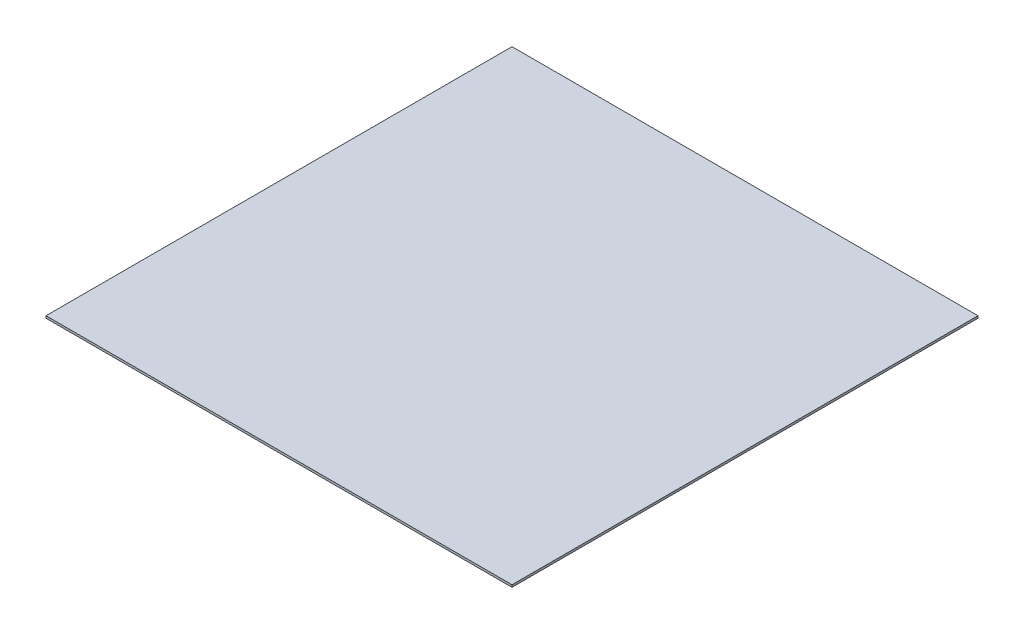
ISO-10303-21;
HEADER;
FILE_DESCRIPTION(('STEP AP214'),'2;1');
FILE_NAME('part.step','',(''),(''),'','','');
FILE_SCHEMA(('AUTOMOTIVE_DESIGN { 1 0 10303 214 1 1 1 1 }'));
ENDSEC;
DATA;
#1=APPLICATION_CONTEXT('core data for automotive mechanical design processes');
#2=APPLICATION_PROTOCOL_DEFINITION('international standard','automotive_design',2000,#1);
#3=PRODUCT_CONTEXT('',#1,'mechanical');
#4=PRODUCT('Part','Part','',(#3));
#5=PRODUCT_RELATED_PRODUCT_CATEGORY('part','',(#4));
#6=PRODUCT_DEFINITION_FORMATION('','',#4);
#7=PRODUCT_DEFINITION_CONTEXT('part definition',#1,'design');
#8=PRODUCT_DEFINITION('design','',#6,#7);
#9=PRODUCT_DEFINITION_SHAPE('','',#8);
#10=(LENGTH_UNIT() NAMED_UNIT(*) SI_UNIT(.MILLI.,.METRE.));
#11=(NAMED_UNIT(*) PLANE_ANGLE_UNIT() SI_UNIT($,.RADIAN.));
#12=(NAMED_UNIT(*) SI_UNIT($,.STERADIAN.) SOLID_ANGLE_UNIT());
#13=UNCERTAINTY_MEASURE_WITH_UNIT(LENGTH_MEASURE(1.E-05),#10,'distance_accuracy_value','');
#14=(GEOMETRIC_REPRESENTATION_CONTEXT(3) GLOBAL_UNCERTAINTY_ASSIGNED_CONTEXT((#13)) GLOBAL_UNIT_ASSIGNED_CONTEXT((#10,
#11,#12)) REPRESENTATION_CONTEXT('',''));
#15=CARTESIAN_POINT('',(0.,0.,0.));
#16=DIRECTION('',(0.,0.,1.));
#17=DIRECTION('',(1.,0.,0.));
#18=AXIS2_PLACEMENT_3D('',#15,#16,#17);
#19=CARTESIAN_POINT('',(0.,9.525,0.));
#20=DIRECTION('',(1.,0.,0.));
#21=DIRECTION('',(0.,0.,-1.));
#22=AXIS2_PLACEMENT_3D('',#19,#20,#21);
#23=PLANE('',#22);
#24=DIRECTION('',(0.,0.,1.));
#25=VECTOR('',#24,1.);
#26=CARTESIAN_POINT('',(0.,0.,0.));
#27=LINE('',#26,#25);
#28=CARTESIAN_POINT('',(0.,0.,0.));
#29=VERTEX_POINT('',#28);
#30=CARTESIAN_POINT('',(0.,0.,2000.));
#31=VERTEX_POINT('',#30);
#32=EDGE_CURVE('E97',#29,#31,#27,.T.);
#33=ORIENTED_EDGE('',*,*,#32,.T.);
#34=DIRECTION('',(0.,-1.,0.));
#35=VECTOR('',#34,1.);
#36=CARTESIAN_POINT('',(0.,9.525,2000.));
#37=LINE('',#36,#35);
#38=CARTESIAN_POINT('',(0.,9.525,2000.));
#39=VERTEX_POINT('',#38);
#40=EDGE_CURVE('E11',#39,#31,#37,.T.);
#41=ORIENTED_EDGE('',*,*,#40,.F.);
#42=DIRECTION('',(0.,0.,1.));
#43=VECTOR('',#42,1.);
#44=CARTESIAN_POINT('',(0.,9.525,0.));
#45=LINE('',#44,#43);
#46=CARTESIAN_POINT('',(0.,9.525,0.));
#47=VERTEX_POINT('',#46);
#48=EDGE_CURVE('E85',#47,#39,#45,.T.);
#49=ORIENTED_EDGE('',*,*,#48,.F.);
#50=DIRECTION('',(0.,-1.,0.));
#51=VECTOR('',#50,1.);
#52=CARTESIAN_POINT('',(0.,9.525,0.));
#53=LINE('',#52,#51);
#54=EDGE_CURVE('E93',#47,#29,#53,.T.);
#55=ORIENTED_EDGE('',*,*,#54,.T.);
#56=EDGE_LOOP('',(#33,#41,#49,#55));
#57=FACE_BOUND('',#56,.T.);
#58=ADVANCED_FACE('F34',(#57),#23,.F.);
#59=CARTESIAN_POINT('',(0.,9.525,2000.));
#60=DIRECTION('',(0.,0.,-1.));
#61=DIRECTION('',(-1.,0.,0.));
#62=AXIS2_PLACEMENT_3D('',#59,#60,#61);
#63=PLANE('',#62);
#64=DIRECTION('',(1.,0.,0.));
#65=VECTOR('',#64,1.);
#66=CARTESIAN_POINT('',(0.,0.,2000.));
#67=LINE('',#66,#65);
#68=CARTESIAN_POINT('',(2000.,0.,2000.));
#69=VERTEX_POINT('',#68);
#70=EDGE_CURVE('E89',#31,#69,#67,.T.);
#71=ORIENTED_EDGE('',*,*,#70,.T.);
#72=DIRECTION('',(0.,-1.,0.));
#73=VECTOR('',#72,1.);
#74=CARTESIAN_POINT('',(2000.,9.525,2000.));
#75=LINE('',#74,#73);
#76=CARTESIAN_POINT('',(2000.,9.525,2000.));
#77=VERTEX_POINT('',#76);
#78=EDGE_CURVE('E42',#77,#69,#75,.T.);
#79=ORIENTED_EDGE('',*,*,#78,.F.);
#80=DIRECTION('',(1.,0.,0.));
#81=VECTOR('',#80,1.);
#82=CARTESIAN_POINT('',(0.,9.525,2000.));
#83=LINE('',#82,#81);
#84=EDGE_CURVE('E80',#39,#77,#83,.T.);
#85=ORIENTED_EDGE('',*,*,#84,.F.);
#86=ORIENTED_EDGE('',*,*,#40,.T.);
#87=EDGE_LOOP('',(#71,#79,#85,#86));
#88=FACE_BOUND('',#87,.T.);
#89=ADVANCED_FACE('F88',(#88),#63,.F.);
#90=CARTESIAN_POINT('',(2000.,9.525,0.));
#91=DIRECTION('',(-1.,0.,0.));
#92=DIRECTION('',(0.,0.,1.));
#93=AXIS2_PLACEMENT_3D('',#90,#91,#92);
#94=PLANE('',#93);
#95=DIRECTION('',(0.,0.,-1.));
#96=VECTOR('',#95,1.);
#97=CARTESIAN_POINT('',(2000.,0.,0.));
#98=LINE('',#97,#96);
#99=CARTESIAN_POINT('',(2000.,0.,0.));
#100=VERTEX_POINT('',#99);
#101=EDGE_CURVE('E67',#69,#100,#98,.T.);
#102=ORIENTED_EDGE('',*,*,#101,.T.);
#103=DIRECTION('',(0.,-1.,0.));
#104=VECTOR('',#103,1.);
#105=CARTESIAN_POINT('',(2000.,9.525,0.));
#106=LINE('',#105,#104);
#107=CARTESIAN_POINT('',(2000.,9.525,0.));
#108=VERTEX_POINT('',#107);
#109=EDGE_CURVE('E90',#108,#100,#106,.T.);
#110=ORIENTED_EDGE('',*,*,#109,.F.);
#111=DIRECTION('',(0.,0.,-1.));
#112=VECTOR('',#111,1.);
#113=CARTESIAN_POINT('',(2000.,9.525,0.));
#114=LINE('',#113,#112);
#115=EDGE_CURVE('E83',#77,#108,#114,.T.);
#116=ORIENTED_EDGE('',*,*,#115,.F.);
#117=ORIENTED_EDGE('',*,*,#78,.T.);
#118=EDGE_LOOP('',(#102,#110,#116,#117));
#119=FACE_BOUND('',#118,.T.);
#120=ADVANCED_FACE('F91',(#119),#94,.F.);
#121=CARTESIAN_POINT('',(0.,9.525,0.));
#122=DIRECTION('',(0.,0.,1.));
#123=DIRECTION('',(1.,0.,0.));
#124=AXIS2_PLACEMENT_3D('',#121,#122,#123);
#125=PLANE('',#124);
#126=DIRECTION('',(-1.,0.,0.));
#127=VECTOR('',#126,1.);
#128=CARTESIAN_POINT('',(0.,0.,0.));
#129=LINE('',#128,#127);
#130=EDGE_CURVE('E73',#100,#29,#129,.T.);
#131=ORIENTED_EDGE('',*,*,#130,.T.);
#132=ORIENTED_EDGE('',*,*,#54,.F.);
#133=DIRECTION('',(-1.,0.,0.));
#134=VECTOR('',#133,1.);
#135=CARTESIAN_POINT('',(0.,9.525,0.));
#136=LINE('',#135,#134);
#137=EDGE_CURVE('E50',#108,#47,#136,.T.);
#138=ORIENTED_EDGE('',*,*,#137,.F.);
#139=ORIENTED_EDGE('',*,*,#109,.T.);
#140=EDGE_LOOP('',(#131,#132,#138,#139));
#141=FACE_BOUND('',#140,.T.);
#142=ADVANCED_FACE('F104',(#141),#125,.F.);
#143=CARTESIAN_POINT('',(0.,9.525,0.));
#144=DIRECTION('',(0.,1.,0.));
#145=DIRECTION('',(0.,0.,1.));
#146=AXIS2_PLACEMENT_3D('',#143,#144,#145);
#147=PLANE('',#146);
#148=ORIENTED_EDGE('',*,*,#48,.T.);
#149=ORIENTED_EDGE('',*,*,#84,.T.);
#150=ORIENTED_EDGE('',*,*,#115,.T.);
#151=ORIENTED_EDGE('',*,*,#137,.T.);
#152=EDGE_LOOP('',(#148,#149,#150,#151));
#153=FACE_BOUND('',#152,.T.);
#154=ADVANCED_FACE('F81',(#153),#147,.T.);
#155=CARTESIAN_POINT('',(0.,0.,0.));
#156=DIRECTION('',(0.,1.,0.));
#157=DIRECTION('',(0.,0.,1.));
#158=AXIS2_PLACEMENT_3D('',#155,#156,#157);
#159=PLANE('',#158);
#160=ORIENTED_EDGE('',*,*,#32,.F.);
#161=ORIENTED_EDGE('',*,*,#130,.F.);
#162=ORIENTED_EDGE('',*,*,#101,.F.);
#163=ORIENTED_EDGE('',*,*,#70,.F.);
#164=EDGE_LOOP('',(#160,#161,#162,#163));
#165=FACE_BOUND('',#164,.T.);
#166=ADVANCED_FACE('F107',(#165),#159,.F.);
#167=CLOSED_SHELL('',(#58,#89,#120,#142,#154,#166));
#168=MANIFOLD_SOLID_BREP('B2',#167);
#169=ADVANCED_BREP_SHAPE_REPRESENTATION('',(#18,#168),#14);
#170=SHAPE_DEFINITION_REPRESENTATION(#9,#169);
ENDSEC;
END-ISO-10303-21;
